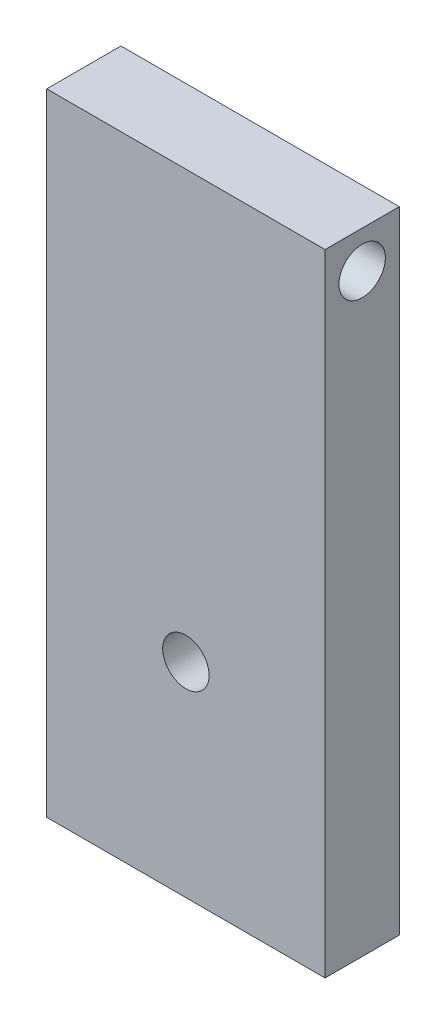
ISO-10303-21;
HEADER;
FILE_DESCRIPTION(('STEP AP214'),'2;1');
FILE_NAME('part.step','',(''),(''),'','','');
FILE_SCHEMA(('AUTOMOTIVE_DESIGN { 1 0 10303 214 1 1 1 1 }'));
ENDSEC;
DATA;
#1=APPLICATION_CONTEXT('core data for automotive mechanical design processes');
#2=APPLICATION_PROTOCOL_DEFINITION('international standard','automotive_design',2000,#1);
#3=PRODUCT_CONTEXT('',#1,'mechanical');
#4=PRODUCT('Part','Part','',(#3));
#5=PRODUCT_RELATED_PRODUCT_CATEGORY('part','',(#4));
#6=PRODUCT_DEFINITION_FORMATION('','',#4);
#7=PRODUCT_DEFINITION_CONTEXT('part definition',#1,'design');
#8=PRODUCT_DEFINITION('design','',#6,#7);
#9=PRODUCT_DEFINITION_SHAPE('','',#8);
#10=(LENGTH_UNIT() NAMED_UNIT(*) SI_UNIT(.MILLI.,.METRE.));
#11=(NAMED_UNIT(*) PLANE_ANGLE_UNIT() SI_UNIT($,.RADIAN.));
#12=(NAMED_UNIT(*) SI_UNIT($,.STERADIAN.) SOLID_ANGLE_UNIT());
#13=UNCERTAINTY_MEASURE_WITH_UNIT(LENGTH_MEASURE(1.E-05),#10,'distance_accuracy_value','');
#14=(GEOMETRIC_REPRESENTATION_CONTEXT(3) GLOBAL_UNCERTAINTY_ASSIGNED_CONTEXT((#13)) GLOBAL_UNIT_ASSIGNED_CONTEXT((#10,
#11,#12)) REPRESENTATION_CONTEXT('',''));
#15=CARTESIAN_POINT('',(0.,0.,0.));
#16=DIRECTION('',(0.,0.,1.));
#17=DIRECTION('',(1.,0.,0.));
#18=AXIS2_PLACEMENT_3D('',#15,#16,#17);
#19=CARTESIAN_POINT('',(15.,34.,-8.));
#20=DIRECTION('',(1.,0.,0.));
#21=DIRECTION('',(0.,1.,0.));
#22=AXIS2_PLACEMENT_3D('',#19,#20,#21);
#23=PLANE('',#22);
#24=CARTESIAN_POINT('',(15.,30.,-4.));
#25=DIRECTION('',(1.,0.,0.));
#26=DIRECTION('',(0.,1.,0.));
#27=AXIS2_PLACEMENT_3D('',#24,#25,#26);
#28=CIRCLE('',#27,2.5);
#29=CARTESIAN_POINT('',(15.,32.5,-4.));
#30=VERTEX_POINT('',#29);
#31=EDGE_CURVE('E178',#30,#30,#28,.T.);
#32=ORIENTED_EDGE('',*,*,#31,.F.);
#33=EDGE_LOOP('',(#32));
#34=FACE_BOUND('',#33,.T.);
#35=DIRECTION('',(0.,1.,0.));
#36=VECTOR('',#35,1.);
#37=CARTESIAN_POINT('',(15.,34.,0.));
#38=LINE('',#37,#36);
#39=CARTESIAN_POINT('',(15.,-34.,0.));
#40=VERTEX_POINT('',#39);
#41=CARTESIAN_POINT('',(15.,34.,0.));
#42=VERTEX_POINT('',#41);
#43=EDGE_CURVE('E97',#40,#42,#38,.T.);
#44=ORIENTED_EDGE('',*,*,#43,.F.);
#45=DIRECTION('',(0.,0.,1.));
#46=VECTOR('',#45,1.);
#47=CARTESIAN_POINT('',(15.,-34.,-8.));
#48=LINE('',#47,#46);
#49=CARTESIAN_POINT('',(15.,-34.,-8.));
#50=VERTEX_POINT('',#49);
#51=EDGE_CURVE('E11',#50,#40,#48,.T.);
#52=ORIENTED_EDGE('',*,*,#51,.F.);
#53=DIRECTION('',(0.,1.,0.));
#54=VECTOR('',#53,1.);
#55=CARTESIAN_POINT('',(15.,34.,-8.));
#56=LINE('',#55,#54);
#57=CARTESIAN_POINT('',(15.,34.,-8.));
#58=VERTEX_POINT('',#57);
#59=EDGE_CURVE('E90',#50,#58,#56,.T.);
#60=ORIENTED_EDGE('',*,*,#59,.T.);
#61=DIRECTION('',(0.,0.,1.));
#62=VECTOR('',#61,1.);
#63=CARTESIAN_POINT('',(15.,34.,-8.));
#64=LINE('',#63,#62);
#65=EDGE_CURVE('E35',#58,#42,#64,.T.);
#66=ORIENTED_EDGE('',*,*,#65,.T.);
#67=EDGE_LOOP('',(#44,#52,#60,#66));
#68=FACE_BOUND('',#67,.T.);
#69=ADVANCED_FACE('F32',(#34,#68),#23,.T.);
#70=CARTESIAN_POINT('',(-15.,-34.,-8.));
#71=DIRECTION('',(0.,-1.,0.));
#72=DIRECTION('',(0.,0.,-1.));
#73=AXIS2_PLACEMENT_3D('',#70,#71,#72);
#74=PLANE('',#73);
#75=CARTESIAN_POINT('',(10.,-34.,-4.));
#76=DIRECTION('',(0.,-1.,0.));
#77=DIRECTION('',(0.,0.,-1.));
#78=AXIS2_PLACEMENT_3D('',#75,#76,#77);
#79=CIRCLE('',#78,2.);
#80=CARTESIAN_POINT('',(10.,-34.,-6.));
#81=VERTEX_POINT('',#80);
#82=EDGE_CURVE('E166',#81,#81,#79,.T.);
#83=ORIENTED_EDGE('',*,*,#82,.F.);
#84=EDGE_LOOP('',(#83));
#85=FACE_BOUND('',#84,.T.);
#86=CARTESIAN_POINT('',(-10.,-34.,-4.));
#87=DIRECTION('',(0.,-1.,0.));
#88=DIRECTION('',(0.,0.,-1.));
#89=AXIS2_PLACEMENT_3D('',#86,#87,#88);
#90=CIRCLE('',#89,2.);
#91=CARTESIAN_POINT('',(-10.,-34.,-6.));
#92=VERTEX_POINT('',#91);
#93=EDGE_CURVE('E172',#92,#92,#90,.T.);
#94=ORIENTED_EDGE('',*,*,#93,.F.);
#95=EDGE_LOOP('',(#94));
#96=FACE_BOUND('',#95,.T.);
#97=DIRECTION('',(1.,0.,0.));
#98=VECTOR('',#97,1.);
#99=CARTESIAN_POINT('',(-15.,-34.,0.));
#100=LINE('',#99,#98);
#101=CARTESIAN_POINT('',(-15.,-34.,0.));
#102=VERTEX_POINT('',#101);
#103=EDGE_CURVE('E92',#102,#40,#100,.T.);
#104=ORIENTED_EDGE('',*,*,#103,.F.);
#105=DIRECTION('',(0.,0.,1.));
#106=VECTOR('',#105,1.);
#107=CARTESIAN_POINT('',(-15.,-34.,-8.));
#108=LINE('',#107,#106);
#109=CARTESIAN_POINT('',(-15.,-34.,-8.));
#110=VERTEX_POINT('',#109);
#111=EDGE_CURVE('E41',#110,#102,#108,.T.);
#112=ORIENTED_EDGE('',*,*,#111,.F.);
#113=DIRECTION('',(1.,0.,0.));
#114=VECTOR('',#113,1.);
#115=CARTESIAN_POINT('',(-15.,-34.,-8.));
#116=LINE('',#115,#114);
#117=EDGE_CURVE('E87',#110,#50,#116,.T.);
#118=ORIENTED_EDGE('',*,*,#117,.T.);
#119=ORIENTED_EDGE('',*,*,#51,.T.);
#120=EDGE_LOOP('',(#104,#112,#118,#119));
#121=FACE_BOUND('',#120,.T.);
#122=ADVANCED_FACE('F108',(#85,#96,#121),#74,.T.);
#123=CARTESIAN_POINT('',(-15.,34.,-8.));
#124=DIRECTION('',(-1.,0.,0.));
#125=DIRECTION('',(0.,-1.,0.));
#126=AXIS2_PLACEMENT_3D('',#123,#124,#125);
#127=PLANE('',#126);
#128=CARTESIAN_POINT('',(-15.,30.,-4.));
#129=DIRECTION('',(1.,0.,0.));
#130=DIRECTION('',(0.,1.,0.));
#131=AXIS2_PLACEMENT_3D('',#128,#129,#130);
#132=CIRCLE('',#131,2.5);
#133=CARTESIAN_POINT('',(-15.,32.5,-4.));
#134=VERTEX_POINT('',#133);
#135=EDGE_CURVE('E101',#134,#134,#132,.T.);
#136=ORIENTED_EDGE('',*,*,#135,.T.);
#137=EDGE_LOOP('',(#136));
#138=FACE_BOUND('',#137,.T.);
#139=DIRECTION('',(0.,-1.,0.));
#140=VECTOR('',#139,1.);
#141=CARTESIAN_POINT('',(-15.,34.,0.));
#142=LINE('',#141,#140);
#143=CARTESIAN_POINT('',(-15.,34.,0.));
#144=VERTEX_POINT('',#143);
#145=EDGE_CURVE('E82',#144,#102,#142,.T.);
#146=ORIENTED_EDGE('',*,*,#145,.F.);
#147=DIRECTION('',(0.,0.,1.));
#148=VECTOR('',#147,1.);
#149=CARTESIAN_POINT('',(-15.,34.,-8.));
#150=LINE('',#149,#148);
#151=CARTESIAN_POINT('',(-15.,34.,-8.));
#152=VERTEX_POINT('',#151);
#153=EDGE_CURVE('E77',#152,#144,#150,.T.);
#154=ORIENTED_EDGE('',*,*,#153,.F.);
#155=DIRECTION('',(0.,-1.,0.));
#156=VECTOR('',#155,1.);
#157=CARTESIAN_POINT('',(-15.,34.,-8.));
#158=LINE('',#157,#156);
#159=EDGE_CURVE('E80',#152,#110,#158,.T.);
#160=ORIENTED_EDGE('',*,*,#159,.T.);
#161=ORIENTED_EDGE('',*,*,#111,.T.);
#162=EDGE_LOOP('',(#146,#154,#160,#161));
#163=FACE_BOUND('',#162,.T.);
#164=ADVANCED_FACE('F79',(#138,#163),#127,.T.);
#165=CARTESIAN_POINT('',(-15.,34.,-8.));
#166=DIRECTION('',(0.,1.,0.));
#167=DIRECTION('',(0.,0.,1.));
#168=AXIS2_PLACEMENT_3D('',#165,#166,#167);
#169=PLANE('',#168);
#170=DIRECTION('',(-1.,0.,0.));
#171=VECTOR('',#170,1.);
#172=CARTESIAN_POINT('',(-15.,34.,0.));
#173=LINE('',#172,#171);
#174=EDGE_CURVE('E100',#42,#144,#173,.T.);
#175=ORIENTED_EDGE('',*,*,#174,.F.);
#176=ORIENTED_EDGE('',*,*,#65,.F.);
#177=DIRECTION('',(-1.,0.,0.));
#178=VECTOR('',#177,1.);
#179=CARTESIAN_POINT('',(-15.,34.,-8.));
#180=LINE('',#179,#178);
#181=EDGE_CURVE('E86',#58,#152,#180,.T.);
#182=ORIENTED_EDGE('',*,*,#181,.T.);
#183=ORIENTED_EDGE('',*,*,#153,.T.);
#184=EDGE_LOOP('',(#175,#176,#182,#183));
#185=FACE_BOUND('',#184,.T.);
#186=ADVANCED_FACE('F89',(#185),#169,.T.);
#187=CARTESIAN_POINT('',(0.,0.,-8.));
#188=DIRECTION('',(0.,0.,1.));
#189=DIRECTION('',(1.,0.,0.));
#190=AXIS2_PLACEMENT_3D('',#187,#188,#189);
#191=PLANE('',#190);
#192=CARTESIAN_POINT('',(0.,-12.,-8.));
#193=DIRECTION('',(0.,0.,1.));
#194=DIRECTION('',(1.,0.,0.));
#195=AXIS2_PLACEMENT_3D('',#192,#193,#194);
#196=CIRCLE('',#195,2.5);
#197=CARTESIAN_POINT('',(2.49999999999999,-12.,-8.));
#198=VERTEX_POINT('',#197);
#199=EDGE_CURVE('E161',#198,#198,#196,.T.);
#200=ORIENTED_EDGE('',*,*,#199,.T.);
#201=EDGE_LOOP('',(#200));
#202=FACE_BOUND('',#201,.T.);
#203=ORIENTED_EDGE('',*,*,#59,.F.);
#204=ORIENTED_EDGE('',*,*,#117,.F.);
#205=ORIENTED_EDGE('',*,*,#159,.F.);
#206=ORIENTED_EDGE('',*,*,#181,.F.);
#207=EDGE_LOOP('',(#203,#204,#205,#206));
#208=FACE_BOUND('',#207,.T.);
#209=ADVANCED_FACE('F85',(#202,#208),#191,.F.);
#210=CARTESIAN_POINT('',(0.,0.,0.));
#211=DIRECTION('',(0.,0.,1.));
#212=DIRECTION('',(1.,0.,0.));
#213=AXIS2_PLACEMENT_3D('',#210,#211,#212);
#214=PLANE('',#213);
#215=CARTESIAN_POINT('',(0.,-12.,0.));
#216=DIRECTION('',(0.,0.,1.));
#217=DIRECTION('',(1.,0.,0.));
#218=AXIS2_PLACEMENT_3D('',#215,#216,#217);
#219=CIRCLE('',#218,2.5);
#220=CARTESIAN_POINT('',(2.49999999999999,-12.,0.));
#221=VERTEX_POINT('',#220);
#222=EDGE_CURVE('E164',#221,#221,#219,.T.);
#223=ORIENTED_EDGE('',*,*,#222,.F.);
#224=EDGE_LOOP('',(#223));
#225=FACE_BOUND('',#224,.T.);
#226=ORIENTED_EDGE('',*,*,#43,.T.);
#227=ORIENTED_EDGE('',*,*,#174,.T.);
#228=ORIENTED_EDGE('',*,*,#145,.T.);
#229=ORIENTED_EDGE('',*,*,#103,.T.);
#230=EDGE_LOOP('',(#226,#227,#228,#229));
#231=FACE_BOUND('',#230,.T.);
#232=ADVANCED_FACE('F107',(#225,#231),#214,.T.);
#233=CARTESIAN_POINT('',(-15.,30.,-4.));
#234=DIRECTION('',(1.,0.,0.));
#235=DIRECTION('',(0.,1.,0.));
#236=AXIS2_PLACEMENT_3D('',#233,#234,#235);
#237=CYLINDRICAL_SURFACE('',#236,2.5);
#238=ORIENTED_EDGE('',*,*,#135,.F.);
#239=EDGE_LOOP('',(#238));
#240=FACE_BOUND('',#239,.T.);
#241=ORIENTED_EDGE('',*,*,#31,.T.);
#242=EDGE_LOOP('',(#241));
#243=FACE_BOUND('',#242,.T.);
#244=ADVANCED_FACE('F131',(#240,#243),#237,.F.);
#245=CARTESIAN_POINT('',(-10.,-19.,-4.));
#246=DIRECTION('',(0.,-1.,0.));
#247=DIRECTION('',(0.,0.,-1.));
#248=AXIS2_PLACEMENT_3D('',#245,#246,#247);
#249=CYLINDRICAL_SURFACE('',#248,2.);
#250=CARTESIAN_POINT('',(-10.,-19.,-4.));
#251=DIRECTION('',(0.,-1.,0.));
#252=DIRECTION('',(0.,0.,-1.));
#253=AXIS2_PLACEMENT_3D('',#250,#251,#252);
#254=CIRCLE('',#253,2.);
#255=CARTESIAN_POINT('',(-10.,-19.,-6.));
#256=VERTEX_POINT('',#255);
#257=EDGE_CURVE('E175',#256,#256,#254,.T.);
#258=ORIENTED_EDGE('',*,*,#257,.F.);
#259=EDGE_LOOP('',(#258));
#260=FACE_BOUND('',#259,.T.);
#261=ORIENTED_EDGE('',*,*,#93,.T.);
#262=EDGE_LOOP('',(#261));
#263=FACE_BOUND('',#262,.T.);
#264=ADVANCED_FACE('F137',(#260,#263),#249,.F.);
#265=CARTESIAN_POINT('',(-10.,-19.,-4.));
#266=DIRECTION('',(0.,-1.,0.));
#267=DIRECTION('',(0.,0.,-1.));
#268=AXIS2_PLACEMENT_3D('',#265,#266,#267);
#269=PLANE('',#268);
#270=ORIENTED_EDGE('',*,*,#257,.T.);
#271=EDGE_LOOP('',(#270));
#272=FACE_BOUND('',#271,.T.);
#273=ADVANCED_FACE('F141',(#272),#269,.T.);
#274=CARTESIAN_POINT('',(10.,-19.,-4.));
#275=DIRECTION('',(0.,-1.,0.));
#276=DIRECTION('',(0.,0.,-1.));
#277=AXIS2_PLACEMENT_3D('',#274,#275,#276);
#278=CYLINDRICAL_SURFACE('',#277,2.);
#279=CARTESIAN_POINT('',(10.,-19.,-4.));
#280=DIRECTION('',(0.,-1.,0.));
#281=DIRECTION('',(0.,0.,-1.));
#282=AXIS2_PLACEMENT_3D('',#279,#280,#281);
#283=CIRCLE('',#282,2.);
#284=CARTESIAN_POINT('',(10.,-19.,-6.));
#285=VERTEX_POINT('',#284);
#286=EDGE_CURVE('E169',#285,#285,#283,.T.);
#287=ORIENTED_EDGE('',*,*,#286,.F.);
#288=EDGE_LOOP('',(#287));
#289=FACE_BOUND('',#288,.T.);
#290=ORIENTED_EDGE('',*,*,#82,.T.);
#291=EDGE_LOOP('',(#290));
#292=FACE_BOUND('',#291,.T.);
#293=ADVANCED_FACE('F145',(#289,#292),#278,.F.);
#294=CARTESIAN_POINT('',(10.,-19.,-4.));
#295=DIRECTION('',(0.,-1.,0.));
#296=DIRECTION('',(0.,0.,-1.));
#297=AXIS2_PLACEMENT_3D('',#294,#295,#296);
#298=PLANE('',#297);
#299=ORIENTED_EDGE('',*,*,#286,.T.);
#300=EDGE_LOOP('',(#299));
#301=FACE_BOUND('',#300,.T.);
#302=ADVANCED_FACE('F149',(#301),#298,.T.);
#303=CARTESIAN_POINT('',(0.,-12.,-8.));
#304=DIRECTION('',(0.,0.,1.));
#305=DIRECTION('',(1.,0.,0.));
#306=AXIS2_PLACEMENT_3D('',#303,#304,#305);
#307=CYLINDRICAL_SURFACE('',#306,2.5);
#308=ORIENTED_EDGE('',*,*,#199,.F.);
#309=EDGE_LOOP('',(#308));
#310=FACE_BOUND('',#309,.T.);
#311=ORIENTED_EDGE('',*,*,#222,.T.);
#312=EDGE_LOOP('',(#311));
#313=FACE_BOUND('',#312,.T.);
#314=ADVANCED_FACE('F153',(#310,#313),#307,.F.);
#315=CLOSED_SHELL('',(#69,#122,#164,#186,#209,#232,#244,#264,#273,#293,#302,#314));
#316=MANIFOLD_SOLID_BREP('B2',#315);
#317=ADVANCED_BREP_SHAPE_REPRESENTATION('',(#18,#316),#14);
#318=SHAPE_DEFINITION_REPRESENTATION(#9,#317);
ENDSEC;
END-ISO-10303-21;
